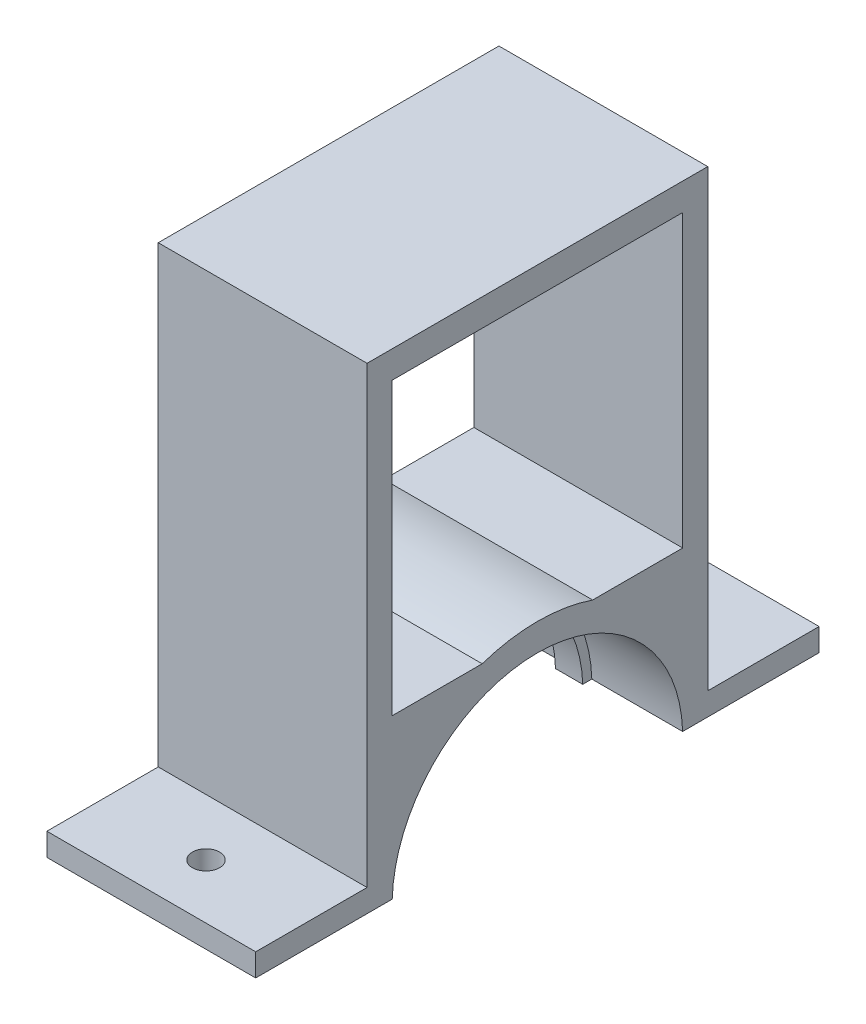
ISO-10303-21;
HEADER;
FILE_DESCRIPTION(('STEP AP214'),'2;1');
FILE_NAME('part.step','',(''),(''),'','','');
FILE_SCHEMA(('AUTOMOTIVE_DESIGN { 1 0 10303 214 1 1 1 1 }'));
ENDSEC;
DATA;
#1=APPLICATION_CONTEXT('core data for automotive mechanical design processes');
#2=APPLICATION_PROTOCOL_DEFINITION('international standard','automotive_design',2000,#1);
#3=PRODUCT_CONTEXT('',#1,'mechanical');
#4=PRODUCT('Part','Part','',(#3));
#5=PRODUCT_RELATED_PRODUCT_CATEGORY('part','',(#4));
#6=PRODUCT_DEFINITION_FORMATION('','',#4);
#7=PRODUCT_DEFINITION_CONTEXT('part definition',#1,'design');
#8=PRODUCT_DEFINITION('design','',#6,#7);
#9=PRODUCT_DEFINITION_SHAPE('','',#8);
#10=(LENGTH_UNIT() NAMED_UNIT(*) SI_UNIT(.MILLI.,.METRE.));
#11=(NAMED_UNIT(*) PLANE_ANGLE_UNIT() SI_UNIT($,.RADIAN.));
#12=(NAMED_UNIT(*) SI_UNIT($,.STERADIAN.) SOLID_ANGLE_UNIT());
#13=UNCERTAINTY_MEASURE_WITH_UNIT(LENGTH_MEASURE(1.E-05),#10,'distance_accuracy_value','');
#14=(GEOMETRIC_REPRESENTATION_CONTEXT(3) GLOBAL_UNCERTAINTY_ASSIGNED_CONTEXT((#13)) GLOBAL_UNIT_ASSIGNED_CONTEXT((#10,
#11,#12)) REPRESENTATION_CONTEXT('',''));
#15=CARTESIAN_POINT('',(0.,0.,0.));
#16=DIRECTION('',(0.,0.,1.));
#17=DIRECTION('',(1.,0.,0.));
#18=AXIS2_PLACEMENT_3D('',#15,#16,#17);
#19=CARTESIAN_POINT('',(-71.7221553746751,0.,0.));
#20=DIRECTION('',(-1.,0.,0.));
#21=DIRECTION('',(0.,0.,1.));
#22=AXIS2_PLACEMENT_3D('',#19,#20,#21);
#23=CYLINDRICAL_SURFACE('',#22,19.);
#24=CARTESIAN_POINT('',(-11.5,0.,0.));
#25=DIRECTION('',(-1.,0.,0.));
#26=DIRECTION('',(0.,0.,1.));
#27=AXIS2_PLACEMENT_3D('',#24,#25,#26);
#28=CIRCLE('',#27,19.);
#29=CARTESIAN_POINT('',(-11.5,18.,6.08276253029831));
#30=VERTEX_POINT('',#29);
#31=CARTESIAN_POINT('',(-11.5,18.,-6.08276253029831));
#32=VERTEX_POINT('',#31);
#33=EDGE_CURVE('E11',#30,#32,#28,.T.);
#34=ORIENTED_EDGE('',*,*,#33,.F.);
#35=DIRECTION('',(-1.,0.,0.));
#36=VECTOR('',#35,1.);
#37=CARTESIAN_POINT('',(11.5,18.,6.08276253029831));
#38=LINE('',#37,#36);
#39=CARTESIAN_POINT('',(11.5,18.,6.08276253029831));
#40=VERTEX_POINT('',#39);
#41=EDGE_CURVE('E250',#40,#30,#38,.T.);
#42=ORIENTED_EDGE('',*,*,#41,.F.);
#43=CARTESIAN_POINT('',(11.5,0.,0.));
#44=DIRECTION('',(-1.,0.,0.));
#45=DIRECTION('',(0.,0.,1.));
#46=AXIS2_PLACEMENT_3D('',#43,#44,#45);
#47=CIRCLE('',#46,19.);
#48=CARTESIAN_POINT('',(11.5,18.,-6.08276253029831));
#49=VERTEX_POINT('',#48);
#50=EDGE_CURVE('E52',#40,#49,#47,.T.);
#51=ORIENTED_EDGE('',*,*,#50,.T.);
#52=DIRECTION('',(-1.,0.,0.));
#53=VECTOR('',#52,1.);
#54=CARTESIAN_POINT('',(11.5,18.,-6.08276253029831));
#55=LINE('',#54,#53);
#56=EDGE_CURVE('E238',#49,#32,#55,.T.);
#57=ORIENTED_EDGE('',*,*,#56,.T.);
#58=EDGE_LOOP('',(#34,#42,#51,#57));
#59=FACE_BOUND('',#58,.T.);
#60=ADVANCED_FACE('F43',(#59),#23,.T.);
#61=CARTESIAN_POINT('',(11.5,3.00000000000001,-31.0262507904691));
#62=DIRECTION('',(0.,0.,1.));
#63=DIRECTION('',(1.,0.,0.));
#64=AXIS2_PLACEMENT_3D('',#61,#62,#63);
#65=PLANE('',#64);
#66=DIRECTION('',(0.,1.,0.));
#67=VECTOR('',#66,1.);
#68=CARTESIAN_POINT('',(11.5,3.00000000000001,-31.0262507904691));
#69=LINE('',#68,#67);
#70=CARTESIAN_POINT('',(11.5,0.5,-31.0262507904691));
#71=VERTEX_POINT('',#70);
#72=CARTESIAN_POINT('',(11.5,3.00000000000001,-31.0262507904691));
#73=VERTEX_POINT('',#72);
#74=EDGE_CURVE('E315',#71,#73,#69,.T.);
#75=ORIENTED_EDGE('',*,*,#74,.F.);
#76=DIRECTION('',(-1.,0.,0.));
#77=VECTOR('',#76,1.);
#78=CARTESIAN_POINT('',(11.5,0.5,-31.0262507904691));
#79=LINE('',#78,#77);
#80=CARTESIAN_POINT('',(-11.5,0.5,-31.0262507904691));
#81=VERTEX_POINT('',#80);
#82=EDGE_CURVE('E280',#71,#81,#79,.T.);
#83=ORIENTED_EDGE('',*,*,#82,.T.);
#84=DIRECTION('',(0.,1.,0.));
#85=VECTOR('',#84,1.);
#86=CARTESIAN_POINT('',(-11.5,3.00000000000001,-31.0262507904691));
#87=LINE('',#86,#85);
#88=CARTESIAN_POINT('',(-11.5,3.00000000000001,-31.0262507904691));
#89=VERTEX_POINT('',#88);
#90=EDGE_CURVE('E303',#81,#89,#87,.T.);
#91=ORIENTED_EDGE('',*,*,#90,.T.);
#92=DIRECTION('',(-1.,0.,0.));
#93=VECTOR('',#92,1.);
#94=CARTESIAN_POINT('',(11.5,3.00000000000001,-31.0262507904691));
#95=LINE('',#94,#93);
#96=EDGE_CURVE('E309',#73,#89,#95,.T.);
#97=ORIENTED_EDGE('',*,*,#96,.F.);
#98=EDGE_LOOP('',(#75,#83,#91,#97));
#99=FACE_BOUND('',#98,.T.);
#100=ADVANCED_FACE('F367',(#99),#65,.F.);
#101=CARTESIAN_POINT('',(-71.7221553746751,0.,0.));
#102=DIRECTION('',(-1.,0.,0.));
#103=DIRECTION('',(0.,0.,1.));
#104=AXIS2_PLACEMENT_3D('',#101,#102,#103);
#105=CYLINDRICAL_SURFACE('',#104,16.);
#106=CARTESIAN_POINT('',(-11.5,0.,0.));
#107=DIRECTION('',(-1.,0.,0.));
#108=DIRECTION('',(0.,0.,1.));
#109=AXIS2_PLACEMENT_3D('',#106,#107,#108);
#110=CIRCLE('',#109,16.);
#111=CARTESIAN_POINT('',(-11.5,0.5,15.9921855917195));
#112=VERTEX_POINT('',#111);
#113=CARTESIAN_POINT('',(-11.5,0.5,-15.9921855917195));
#114=VERTEX_POINT('',#113);
#115=EDGE_CURVE('E323',#112,#114,#110,.T.);
#116=ORIENTED_EDGE('',*,*,#115,.T.);
#117=DIRECTION('',(-1.,0.,0.));
#118=VECTOR('',#117,1.);
#119=CARTESIAN_POINT('',(-71.7221553746751,0.5,-15.9921855917195));
#120=LINE('',#119,#118);
#121=CARTESIAN_POINT('',(-1.5,0.5,-15.9921855917195));
#122=VERTEX_POINT('',#121);
#123=EDGE_CURVE('E282',#114,#122,#120,.F.);
#124=ORIENTED_EDGE('',*,*,#123,.T.);
#125=CARTESIAN_POINT('',(-1.5,0.,0.));
#126=DIRECTION('',(-1.,0.,0.));
#127=DIRECTION('',(0.,0.,1.));
#128=AXIS2_PLACEMENT_3D('',#125,#126,#127);
#129=CIRCLE('',#128,16.);
#130=CARTESIAN_POINT('',(-1.5,0.5,15.9921855917195));
#131=VERTEX_POINT('',#130);
#132=EDGE_CURVE('E326',#131,#122,#129,.T.);
#133=ORIENTED_EDGE('',*,*,#132,.F.);
#134=DIRECTION('',(-1.,0.,0.));
#135=VECTOR('',#134,1.);
#136=CARTESIAN_POINT('',(-71.7221553746751,0.5,15.9921855917195));
#137=LINE('',#136,#135);
#138=EDGE_CURVE('E263',#131,#112,#137,.T.);
#139=ORIENTED_EDGE('',*,*,#138,.T.);
#140=EDGE_LOOP('',(#116,#124,#133,#139));
#141=FACE_BOUND('',#140,.T.);
#142=ADVANCED_FACE('F374',(#141),#105,.F.);
#143=CARTESIAN_POINT('',(-1.5,0.,-16.));
#144=DIRECTION('',(1.,0.,0.));
#145=DIRECTION('',(0.,0.,-1.));
#146=AXIS2_PLACEMENT_3D('',#143,#144,#145);
#147=PLANE('',#146);
#148=ORIENTED_EDGE('',*,*,#132,.T.);
#149=DIRECTION('',(0.,0.,1.));
#150=VECTOR('',#149,1.);
#151=CARTESIAN_POINT('',(-1.5,0.5,-16.));
#152=LINE('',#151,#150);
#153=CARTESIAN_POINT('',(-1.5,0.5,-14.9916643505649));
#154=VERTEX_POINT('',#153);
#155=EDGE_CURVE('E270',#122,#154,#152,.T.);
#156=ORIENTED_EDGE('',*,*,#155,.T.);
#157=CARTESIAN_POINT('',(-1.5,0.,0.));
#158=DIRECTION('',(-1.,0.,0.));
#159=DIRECTION('',(0.,0.,1.));
#160=AXIS2_PLACEMENT_3D('',#157,#158,#159);
#161=CIRCLE('',#160,15.);
#162=CARTESIAN_POINT('',(-1.5,0.5,14.9916643505649));
#163=VERTEX_POINT('',#162);
#164=EDGE_CURVE('E329',#163,#154,#161,.T.);
#165=ORIENTED_EDGE('',*,*,#164,.F.);
#166=EDGE_CURVE('E266',#163,#131,#152,.T.);
#167=ORIENTED_EDGE('',*,*,#166,.T.);
#168=EDGE_LOOP('',(#148,#156,#165,#167));
#169=FACE_BOUND('',#168,.T.);
#170=ADVANCED_FACE('F393',(#169),#147,.F.);
#171=CARTESIAN_POINT('',(-71.7221553746751,0.,0.));
#172=DIRECTION('',(-1.,0.,0.));
#173=DIRECTION('',(0.,0.,1.));
#174=AXIS2_PLACEMENT_3D('',#171,#172,#173);
#175=CYLINDRICAL_SURFACE('',#174,15.);
#176=ORIENTED_EDGE('',*,*,#164,.T.);
#177=DIRECTION('',(-1.,0.,0.));
#178=VECTOR('',#177,1.);
#179=CARTESIAN_POINT('',(-71.7221553746751,0.5,-14.991664350565));
#180=LINE('',#179,#178);
#181=CARTESIAN_POINT('',(1.5,0.5,-14.991664350565));
#182=VERTEX_POINT('',#181);
#183=EDGE_CURVE('E285',#154,#182,#180,.F.);
#184=ORIENTED_EDGE('',*,*,#183,.T.);
#185=CARTESIAN_POINT('',(1.5,0.,0.));
#186=DIRECTION('',(-1.,0.,0.));
#187=DIRECTION('',(0.,0.,1.));
#188=AXIS2_PLACEMENT_3D('',#185,#186,#187);
#189=CIRCLE('',#188,15.);
#190=CARTESIAN_POINT('',(1.5,0.5,14.991664350565));
#191=VERTEX_POINT('',#190);
#192=EDGE_CURVE('E332',#191,#182,#189,.T.);
#193=ORIENTED_EDGE('',*,*,#192,.F.);
#194=DIRECTION('',(-1.,0.,0.));
#195=VECTOR('',#194,1.);
#196=CARTESIAN_POINT('',(-71.7221553746751,0.5,14.991664350565));
#197=LINE('',#196,#195);
#198=EDGE_CURVE('E269',#191,#163,#197,.T.);
#199=ORIENTED_EDGE('',*,*,#198,.T.);
#200=EDGE_LOOP('',(#176,#184,#193,#199));
#201=FACE_BOUND('',#200,.T.);
#202=ADVANCED_FACE('F389',(#201),#175,.F.);
#203=CARTESIAN_POINT('',(1.5,0.,-16.));
#204=DIRECTION('',(-1.,0.,0.));
#205=DIRECTION('',(0.,0.,1.));
#206=AXIS2_PLACEMENT_3D('',#203,#204,#205);
#207=PLANE('',#206);
#208=CARTESIAN_POINT('',(1.5,0.,0.));
#209=DIRECTION('',(-1.,0.,0.));
#210=DIRECTION('',(0.,0.,1.));
#211=AXIS2_PLACEMENT_3D('',#208,#209,#210);
#212=CIRCLE('',#211,16.);
#213=CARTESIAN_POINT('',(1.5,0.5,15.9921855917195));
#214=VERTEX_POINT('',#213);
#215=CARTESIAN_POINT('',(1.5,0.5,-15.9921855917195));
#216=VERTEX_POINT('',#215);
#217=EDGE_CURVE('E335',#214,#216,#212,.T.);
#218=ORIENTED_EDGE('',*,*,#217,.F.);
#219=DIRECTION('',(0.,0.,-1.));
#220=VECTOR('',#219,1.);
#221=CARTESIAN_POINT('',(1.5,0.5,-16.));
#222=LINE('',#221,#220);
#223=EDGE_CURVE('E273',#214,#191,#222,.T.);
#224=ORIENTED_EDGE('',*,*,#223,.T.);
#225=ORIENTED_EDGE('',*,*,#192,.T.);
#226=EDGE_CURVE('E277',#182,#216,#222,.T.);
#227=ORIENTED_EDGE('',*,*,#226,.T.);
#228=EDGE_LOOP('',(#218,#224,#225,#227));
#229=FACE_BOUND('',#228,.T.);
#230=ADVANCED_FACE('F385',(#229),#207,.F.);
#231=CARTESIAN_POINT('',(-71.7221553746751,0.,0.));
#232=DIRECTION('',(-1.,0.,0.));
#233=DIRECTION('',(0.,0.,1.));
#234=AXIS2_PLACEMENT_3D('',#231,#232,#233);
#235=CYLINDRICAL_SURFACE('',#234,16.);
#236=ORIENTED_EDGE('',*,*,#217,.T.);
#237=DIRECTION('',(-1.,0.,0.));
#238=VECTOR('',#237,1.);
#239=CARTESIAN_POINT('',(-71.7221553746751,0.5,-15.9921855917195));
#240=LINE('',#239,#238);
#241=CARTESIAN_POINT('',(11.5,0.5,-15.9921855917195));
#242=VERTEX_POINT('',#241);
#243=EDGE_CURVE('E288',#216,#242,#240,.F.);
#244=ORIENTED_EDGE('',*,*,#243,.T.);
#245=CARTESIAN_POINT('',(11.5,0.,0.));
#246=DIRECTION('',(-1.,0.,0.));
#247=DIRECTION('',(0.,0.,1.));
#248=AXIS2_PLACEMENT_3D('',#245,#246,#247);
#249=CIRCLE('',#248,16.);
#250=CARTESIAN_POINT('',(11.5,0.5,15.9921855917195));
#251=VERTEX_POINT('',#250);
#252=EDGE_CURVE('E338',#251,#242,#249,.T.);
#253=ORIENTED_EDGE('',*,*,#252,.F.);
#254=DIRECTION('',(-1.,0.,0.));
#255=VECTOR('',#254,1.);
#256=CARTESIAN_POINT('',(-71.7221553746751,0.5,15.9921855917195));
#257=LINE('',#256,#255);
#258=EDGE_CURVE('E276',#251,#214,#257,.T.);
#259=ORIENTED_EDGE('',*,*,#258,.T.);
#260=EDGE_LOOP('',(#236,#244,#253,#259));
#261=FACE_BOUND('',#260,.T.);
#262=ADVANCED_FACE('F382',(#261),#235,.F.);
#263=CARTESIAN_POINT('',(11.5,3.,31.0262507904691));
#264=DIRECTION('',(0.,0.,-1.));
#265=DIRECTION('',(-1.,0.,0.));
#266=AXIS2_PLACEMENT_3D('',#263,#264,#265);
#267=PLANE('',#266);
#268=DIRECTION('',(0.,-1.,0.));
#269=VECTOR('',#268,1.);
#270=CARTESIAN_POINT('',(-11.5,3.,31.0262507904691));
#271=LINE('',#270,#269);
#272=CARTESIAN_POINT('',(-11.5,3.,31.0262507904691));
#273=VERTEX_POINT('',#272);
#274=CARTESIAN_POINT('',(-11.5,0.5,31.0262507904691));
#275=VERTEX_POINT('',#274);
#276=EDGE_CURVE('E298',#273,#275,#271,.T.);
#277=ORIENTED_EDGE('',*,*,#276,.T.);
#278=DIRECTION('',(1.,0.,0.));
#279=VECTOR('',#278,1.);
#280=CARTESIAN_POINT('',(11.5,0.5,31.0262507904691));
#281=LINE('',#280,#279);
#282=CARTESIAN_POINT('',(11.5,0.5,31.0262507904691));
#283=VERTEX_POINT('',#282);
#284=EDGE_CURVE('E256',#275,#283,#281,.T.);
#285=ORIENTED_EDGE('',*,*,#284,.T.);
#286=DIRECTION('',(0.,-1.,0.));
#287=VECTOR('',#286,1.);
#288=CARTESIAN_POINT('',(11.5,3.,31.0262507904691));
#289=LINE('',#288,#287);
#290=CARTESIAN_POINT('',(11.5,3.,31.0262507904691));
#291=VERTEX_POINT('',#290);
#292=EDGE_CURVE('E297',#291,#283,#289,.T.);
#293=ORIENTED_EDGE('',*,*,#292,.F.);
#294=DIRECTION('',(-1.,0.,0.));
#295=VECTOR('',#294,1.);
#296=CARTESIAN_POINT('',(11.5,3.,31.0262507904691));
#297=LINE('',#296,#295);
#298=EDGE_CURVE('E300',#291,#273,#297,.T.);
#299=ORIENTED_EDGE('',*,*,#298,.T.);
#300=EDGE_LOOP('',(#277,#285,#293,#299));
#301=FACE_BOUND('',#300,.T.);
#302=ADVANCED_FACE('F380',(#301),#267,.F.);
#303=CARTESIAN_POINT('',(11.5,0.,-16.));
#304=DIRECTION('',(-1.,0.,0.));
#305=DIRECTION('',(0.,0.,1.));
#306=AXIS2_PLACEMENT_3D('',#303,#304,#305);
#307=PLANE('',#306);
#308=DIRECTION('',(0.,0.,-1.));
#309=VECTOR('',#308,1.);
#310=CARTESIAN_POINT('',(11.5,18.,0.));
#311=LINE('',#310,#309);
#312=CARTESIAN_POINT('',(11.5,18.,-16.));
#313=VERTEX_POINT('',#312);
#314=EDGE_CURVE('E214',#49,#313,#311,.T.);
#315=ORIENTED_EDGE('',*,*,#314,.F.);
#316=ORIENTED_EDGE('',*,*,#50,.F.);
#317=CARTESIAN_POINT('',(11.5,18.,16.));
#318=VERTEX_POINT('',#317);
#319=EDGE_CURVE('E209',#318,#40,#311,.T.);
#320=ORIENTED_EDGE('',*,*,#319,.F.);
#321=DIRECTION('',(0.,-1.,0.));
#322=VECTOR('',#321,1.);
#323=CARTESIAN_POINT('',(11.5,0.,16.));
#324=LINE('',#323,#322);
#325=CARTESIAN_POINT('',(11.5,50.,16.));
#326=VERTEX_POINT('',#325);
#327=EDGE_CURVE('E213',#326,#318,#324,.T.);
#328=ORIENTED_EDGE('',*,*,#327,.F.);
#329=DIRECTION('',(0.,0.,-1.));
#330=VECTOR('',#329,1.);
#331=CARTESIAN_POINT('',(11.5,50.,0.));
#332=LINE('',#331,#330);
#333=CARTESIAN_POINT('',(11.5,50.,-16.));
#334=VERTEX_POINT('',#333);
#335=EDGE_CURVE('E217',#326,#334,#332,.T.);
#336=ORIENTED_EDGE('',*,*,#335,.T.);
#337=DIRECTION('',(0.,-1.,0.));
#338=VECTOR('',#337,1.);
#339=CARTESIAN_POINT('',(11.5,0.,-16.));
#340=LINE('',#339,#338);
#341=EDGE_CURVE('E219',#334,#313,#340,.T.);
#342=ORIENTED_EDGE('',*,*,#341,.T.);
#343=EDGE_LOOP('',(#315,#316,#320,#328,#336,#342));
#344=FACE_BOUND('',#343,.T.);
#345=ORIENTED_EDGE('',*,*,#292,.T.);
#346=DIRECTION('',(0.,0.,-1.));
#347=VECTOR('',#346,1.);
#348=CARTESIAN_POINT('',(11.5,0.5,-16.));
#349=LINE('',#348,#347);
#350=EDGE_CURVE('E68',#283,#251,#349,.T.);
#351=ORIENTED_EDGE('',*,*,#350,.T.);
#352=ORIENTED_EDGE('',*,*,#252,.T.);
#353=EDGE_CURVE('E260',#242,#71,#349,.T.);
#354=ORIENTED_EDGE('',*,*,#353,.T.);
#355=ORIENTED_EDGE('',*,*,#74,.T.);
#356=DIRECTION('',(0.,0.,1.));
#357=VECTOR('',#356,1.);
#358=CARTESIAN_POINT('',(11.5,3.00000000000001,-17.4601205824056));
#359=LINE('',#358,#357);
#360=CARTESIAN_POINT('',(11.5,3.00000000000001,-18.7616630392937));
#361=VERTEX_POINT('',#360);
#362=EDGE_CURVE('E191',#73,#361,#359,.T.);
#363=ORIENTED_EDGE('',*,*,#362,.T.);
#364=DIRECTION('',(0.,1.,0.));
#365=VECTOR('',#364,1.);
#366=CARTESIAN_POINT('',(11.5,0.,-18.7616630392937));
#367=LINE('',#366,#365);
#368=CARTESIAN_POINT('',(11.5,53.,-18.7616630392937));
#369=VERTEX_POINT('',#368);
#370=EDGE_CURVE('E182',#361,#369,#367,.T.);
#371=ORIENTED_EDGE('',*,*,#370,.T.);
#372=DIRECTION('',(0.,0.,-1.));
#373=VECTOR('',#372,1.);
#374=CARTESIAN_POINT('',(11.5,53.,0.));
#375=LINE('',#374,#373);
#376=CARTESIAN_POINT('',(11.5,53.,18.7616630392938));
#377=VERTEX_POINT('',#376);
#378=EDGE_CURVE('E188',#377,#369,#375,.T.);
#379=ORIENTED_EDGE('',*,*,#378,.F.);
#380=DIRECTION('',(0.,1.,0.));
#381=VECTOR('',#380,1.);
#382=CARTESIAN_POINT('',(11.5,0.,18.7616630392938));
#383=LINE('',#382,#381);
#384=CARTESIAN_POINT('',(11.5,3.,18.7616630392938));
#385=VERTEX_POINT('',#384);
#386=EDGE_CURVE('E207',#385,#377,#383,.T.);
#387=ORIENTED_EDGE('',*,*,#386,.F.);
#388=DIRECTION('',(0.,0.,1.));
#389=VECTOR('',#388,1.);
#390=CARTESIAN_POINT('',(11.5,3.,17.4601205824056));
#391=LINE('',#390,#389);
#392=EDGE_CURVE('E295',#385,#291,#391,.T.);
#393=ORIENTED_EDGE('',*,*,#392,.T.);
#394=EDGE_LOOP('',(#345,#351,#352,#354,#355,#363,#371,#379,#387,#393));
#395=FACE_BOUND('',#394,.T.);
#396=ADVANCED_FACE('F185',(#344,#395),#307,.F.);
#397=CARTESIAN_POINT('',(-11.5,0.,-16.));
#398=DIRECTION('',(1.,0.,0.));
#399=DIRECTION('',(0.,0.,-1.));
#400=AXIS2_PLACEMENT_3D('',#397,#398,#399);
#401=PLANE('',#400);
#402=ORIENTED_EDGE('',*,*,#33,.T.);
#403=DIRECTION('',(0.,0.,-1.));
#404=VECTOR('',#403,1.);
#405=CARTESIAN_POINT('',(-11.5,18.,0.));
#406=LINE('',#405,#404);
#407=CARTESIAN_POINT('',(-11.5,18.,-16.));
#408=VERTEX_POINT('',#407);
#409=EDGE_CURVE('E194',#32,#408,#406,.T.);
#410=ORIENTED_EDGE('',*,*,#409,.T.);
#411=DIRECTION('',(0.,-1.,0.));
#412=VECTOR('',#411,1.);
#413=CARTESIAN_POINT('',(-11.5,0.,-16.));
#414=LINE('',#413,#412);
#415=CARTESIAN_POINT('',(-11.5,50.,-16.));
#416=VERTEX_POINT('',#415);
#417=EDGE_CURVE('E235',#416,#408,#414,.T.);
#418=ORIENTED_EDGE('',*,*,#417,.F.);
#419=DIRECTION('',(0.,0.,-1.));
#420=VECTOR('',#419,1.);
#421=CARTESIAN_POINT('',(-11.5,50.,0.));
#422=LINE('',#421,#420);
#423=CARTESIAN_POINT('',(-11.5,50.,16.));
#424=VERTEX_POINT('',#423);
#425=EDGE_CURVE('E233',#424,#416,#422,.T.);
#426=ORIENTED_EDGE('',*,*,#425,.F.);
#427=DIRECTION('',(0.,-1.,0.));
#428=VECTOR('',#427,1.);
#429=CARTESIAN_POINT('',(-11.5,0.,16.));
#430=LINE('',#429,#428);
#431=CARTESIAN_POINT('',(-11.5,18.,16.));
#432=VERTEX_POINT('',#431);
#433=EDGE_CURVE('E230',#424,#432,#430,.T.);
#434=ORIENTED_EDGE('',*,*,#433,.T.);
#435=EDGE_CURVE('E227',#432,#30,#406,.T.);
#436=ORIENTED_EDGE('',*,*,#435,.T.);
#437=EDGE_LOOP('',(#402,#410,#418,#426,#434,#436));
#438=FACE_BOUND('',#437,.T.);
#439=ORIENTED_EDGE('',*,*,#90,.F.);
#440=DIRECTION('',(0.,0.,1.));
#441=VECTOR('',#440,1.);
#442=CARTESIAN_POINT('',(-11.5,0.5,-16.));
#443=LINE('',#442,#441);
#444=EDGE_CURVE('E60',#81,#114,#443,.T.);
#445=ORIENTED_EDGE('',*,*,#444,.T.);
#446=ORIENTED_EDGE('',*,*,#115,.F.);
#447=EDGE_CURVE('E259',#112,#275,#443,.T.);
#448=ORIENTED_EDGE('',*,*,#447,.T.);
#449=ORIENTED_EDGE('',*,*,#276,.F.);
#450=DIRECTION('',(0.,0.,1.));
#451=VECTOR('',#450,1.);
#452=CARTESIAN_POINT('',(-11.5,3.,17.4601205824056));
#453=LINE('',#452,#451);
#454=CARTESIAN_POINT('',(-11.5,3.,18.7616630392937));
#455=VERTEX_POINT('',#454);
#456=EDGE_CURVE('E301',#455,#273,#453,.T.);
#457=ORIENTED_EDGE('',*,*,#456,.F.);
#458=DIRECTION('',(0.,1.,0.));
#459=VECTOR('',#458,1.);
#460=CARTESIAN_POINT('',(-11.5,0.,18.7616630392938));
#461=LINE('',#460,#459);
#462=CARTESIAN_POINT('',(-11.5,53.,18.7616630392938));
#463=VERTEX_POINT('',#462);
#464=EDGE_CURVE('E224',#455,#463,#461,.T.);
#465=ORIENTED_EDGE('',*,*,#464,.T.);
#466=DIRECTION('',(0.,0.,-1.));
#467=VECTOR('',#466,1.);
#468=CARTESIAN_POINT('',(-11.5,53.,0.));
#469=LINE('',#468,#467);
#470=CARTESIAN_POINT('',(-11.5,53.,-18.7616630392937));
#471=VERTEX_POINT('',#470);
#472=EDGE_CURVE('E222',#463,#471,#469,.T.);
#473=ORIENTED_EDGE('',*,*,#472,.T.);
#474=DIRECTION('',(0.,1.,0.));
#475=VECTOR('',#474,1.);
#476=CARTESIAN_POINT('',(-11.5,0.,-18.7616630392937));
#477=LINE('',#476,#475);
#478=CARTESIAN_POINT('',(-11.5,3.00000000000001,-18.7616630392937));
#479=VERTEX_POINT('',#478);
#480=EDGE_CURVE('E200',#479,#471,#477,.T.);
#481=ORIENTED_EDGE('',*,*,#480,.F.);
#482=DIRECTION('',(0.,0.,1.));
#483=VECTOR('',#482,1.);
#484=CARTESIAN_POINT('',(-11.5,3.00000000000001,-17.4601205824056));
#485=LINE('',#484,#483);
#486=EDGE_CURVE('E312',#89,#479,#485,.T.);
#487=ORIENTED_EDGE('',*,*,#486,.F.);
#488=EDGE_LOOP('',(#439,#445,#446,#448,#449,#457,#465,#473,#481,#487));
#489=FACE_BOUND('',#488,.T.);
#490=ADVANCED_FACE('F45',(#438,#489),#401,.F.);
#491=CARTESIAN_POINT('',(11.5,3.00000000000001,-17.4601205824056));
#492=DIRECTION('',(0.,-1.,0.));
#493=DIRECTION('',(0.,0.,-1.));
#494=AXIS2_PLACEMENT_3D('',#491,#492,#493);
#495=PLANE('',#494);
#496=CARTESIAN_POINT('',(0.,3.00000000000001,-25.));
#497=DIRECTION('',(0.,-1.,0.));
#498=DIRECTION('',(0.,0.,-1.));
#499=AXIS2_PLACEMENT_3D('',#496,#497,#498);
#500=CIRCLE('',#499,1.5);
#501=CARTESIAN_POINT('',(0.,3.00000000000001,-26.5));
#502=VERTEX_POINT('',#501);
#503=EDGE_CURVE('E294',#502,#502,#500,.T.);
#504=ORIENTED_EDGE('',*,*,#503,.T.);
#505=EDGE_LOOP('',(#504));
#506=FACE_BOUND('',#505,.T.);
#507=ORIENTED_EDGE('',*,*,#486,.T.);
#508=DIRECTION('',(-1.,0.,0.));
#509=VECTOR('',#508,1.);
#510=CARTESIAN_POINT('',(-71.7221553746751,3.00000000000001,-18.7616630392937));
#511=LINE('',#510,#509);
#512=EDGE_CURVE('E308',#479,#361,#511,.F.);
#513=ORIENTED_EDGE('',*,*,#512,.T.);
#514=ORIENTED_EDGE('',*,*,#362,.F.);
#515=ORIENTED_EDGE('',*,*,#96,.T.);
#516=EDGE_LOOP('',(#507,#513,#514,#515));
#517=FACE_BOUND('',#516,.T.);
#518=ADVANCED_FACE('F345',(#506,#517),#495,.F.);
#519=CARTESIAN_POINT('',(0.,-11.5,-25.));
#520=DIRECTION('',(0.,1.,0.));
#521=DIRECTION('',(0.,0.,1.));
#522=AXIS2_PLACEMENT_3D('',#519,#520,#521);
#523=CYLINDRICAL_SURFACE('',#522,1.5);
#524=CARTESIAN_POINT('',(0.,0.5,-25.));
#525=DIRECTION('',(0.,1.,0.));
#526=DIRECTION('',(0.,0.,1.));
#527=AXIS2_PLACEMENT_3D('',#524,#525,#526);
#528=CIRCLE('',#527,1.5);
#529=CARTESIAN_POINT('',(0.,0.5,-23.5));
#530=VERTEX_POINT('',#529);
#531=EDGE_CURVE('E47',#530,#530,#528,.F.);
#532=ORIENTED_EDGE('',*,*,#531,.T.);
#533=EDGE_LOOP('',(#532));
#534=FACE_BOUND('',#533,.T.);
#535=ORIENTED_EDGE('',*,*,#503,.F.);
#536=EDGE_LOOP('',(#535));
#537=FACE_BOUND('',#536,.T.);
#538=ADVANCED_FACE('F348',(#534,#537),#523,.F.);
#539=CARTESIAN_POINT('',(11.5,3.,17.4601205824056));
#540=DIRECTION('',(0.,-1.,0.));
#541=DIRECTION('',(0.,0.,-1.));
#542=AXIS2_PLACEMENT_3D('',#539,#540,#541);
#543=PLANE('',#542);
#544=CARTESIAN_POINT('',(0.,3.,25.));
#545=DIRECTION('',(0.,-1.,0.));
#546=DIRECTION('',(0.,0.,-1.));
#547=AXIS2_PLACEMENT_3D('',#544,#545,#546);
#548=CIRCLE('',#547,1.5);
#549=CARTESIAN_POINT('',(0.,3.,23.5));
#550=VERTEX_POINT('',#549);
#551=EDGE_CURVE('E291',#550,#550,#548,.T.);
#552=ORIENTED_EDGE('',*,*,#551,.T.);
#553=EDGE_LOOP('',(#552));
#554=FACE_BOUND('',#553,.T.);
#555=ORIENTED_EDGE('',*,*,#392,.F.);
#556=DIRECTION('',(-1.,0.,0.));
#557=VECTOR('',#556,1.);
#558=CARTESIAN_POINT('',(-71.7221553746751,3.,18.7616630392937));
#559=LINE('',#558,#557);
#560=EDGE_CURVE('E320',#385,#455,#559,.T.);
#561=ORIENTED_EDGE('',*,*,#560,.T.);
#562=ORIENTED_EDGE('',*,*,#456,.T.);
#563=ORIENTED_EDGE('',*,*,#298,.F.);
#564=EDGE_LOOP('',(#555,#561,#562,#563));
#565=FACE_BOUND('',#564,.T.);
#566=ADVANCED_FACE('F350',(#554,#565),#543,.F.);
#567=CARTESIAN_POINT('',(0.,-11.5,25.));
#568=DIRECTION('',(0.,1.,0.));
#569=DIRECTION('',(0.,0.,1.));
#570=AXIS2_PLACEMENT_3D('',#567,#568,#569);
#571=CYLINDRICAL_SURFACE('',#570,1.5);
#572=CARTESIAN_POINT('',(0.,0.5,25.));
#573=DIRECTION('',(0.,1.,0.));
#574=DIRECTION('',(0.,0.,1.));
#575=AXIS2_PLACEMENT_3D('',#572,#573,#574);
#576=CIRCLE('',#575,1.5);
#577=CARTESIAN_POINT('',(0.,0.5,26.5));
#578=VERTEX_POINT('',#577);
#579=EDGE_CURVE('E253',#578,#578,#576,.F.);
#580=ORIENTED_EDGE('',*,*,#579,.T.);
#581=EDGE_LOOP('',(#580));
#582=FACE_BOUND('',#581,.T.);
#583=ORIENTED_EDGE('',*,*,#551,.F.);
#584=EDGE_LOOP('',(#583));
#585=FACE_BOUND('',#584,.T.);
#586=ADVANCED_FACE('F358',(#582,#585),#571,.F.);
#587=CARTESIAN_POINT('',(-26.,0.5,37.8752027899532));
#588=DIRECTION('',(0.,1.,0.));
#589=DIRECTION('',(0.,0.,1.));
#590=AXIS2_PLACEMENT_3D('',#587,#588,#589);
#591=PLANE('',#590);
#592=ORIENTED_EDGE('',*,*,#531,.F.);
#593=EDGE_LOOP('',(#592));
#594=FACE_BOUND('',#593,.T.);
#595=ORIENTED_EDGE('',*,*,#226,.F.);
#596=ORIENTED_EDGE('',*,*,#183,.F.);
#597=ORIENTED_EDGE('',*,*,#155,.F.);
#598=ORIENTED_EDGE('',*,*,#123,.F.);
#599=ORIENTED_EDGE('',*,*,#444,.F.);
#600=ORIENTED_EDGE('',*,*,#82,.F.);
#601=ORIENTED_EDGE('',*,*,#353,.F.);
#602=ORIENTED_EDGE('',*,*,#243,.F.);
#603=EDGE_LOOP('',(#595,#596,#597,#598,#599,#600,#601,#602));
#604=FACE_BOUND('',#603,.T.);
#605=ADVANCED_FACE('F402',(#594,#604),#591,.F.);
#606=ORIENTED_EDGE('',*,*,#579,.F.);
#607=EDGE_LOOP('',(#606));
#608=FACE_BOUND('',#607,.T.);
#609=ORIENTED_EDGE('',*,*,#350,.F.);
#610=ORIENTED_EDGE('',*,*,#284,.F.);
#611=ORIENTED_EDGE('',*,*,#447,.F.);
#612=ORIENTED_EDGE('',*,*,#138,.F.);
#613=ORIENTED_EDGE('',*,*,#166,.F.);
#614=ORIENTED_EDGE('',*,*,#198,.F.);
#615=ORIENTED_EDGE('',*,*,#223,.F.);
#616=ORIENTED_EDGE('',*,*,#258,.F.);
#617=EDGE_LOOP('',(#609,#610,#611,#612,#613,#614,#615,#616));
#618=FACE_BOUND('',#617,.T.);
#619=ADVANCED_FACE('F407',(#608,#618),#591,.F.);
#620=CARTESIAN_POINT('',(11.5,0.,-18.7616630392937));
#621=DIRECTION('',(0.,0.,1.));
#622=DIRECTION('',(1.,0.,0.));
#623=AXIS2_PLACEMENT_3D('',#620,#621,#622);
#624=PLANE('',#623);
#625=ORIENTED_EDGE('',*,*,#480,.T.);
#626=DIRECTION('',(-1.,0.,0.));
#627=VECTOR('',#626,1.);
#628=CARTESIAN_POINT('',(11.5,53.,-18.7616630392937));
#629=LINE('',#628,#627);
#630=EDGE_CURVE('E197',#369,#471,#629,.T.);
#631=ORIENTED_EDGE('',*,*,#630,.F.);
#632=ORIENTED_EDGE('',*,*,#370,.F.);
#633=ORIENTED_EDGE('',*,*,#512,.F.);
#634=EDGE_LOOP('',(#625,#631,#632,#633));
#635=FACE_BOUND('',#634,.T.);
#636=ADVANCED_FACE('F198',(#635),#624,.F.);
#637=CARTESIAN_POINT('',(11.5,53.,0.));
#638=DIRECTION('',(0.,1.,0.));
#639=DIRECTION('',(0.,0.,1.));
#640=AXIS2_PLACEMENT_3D('',#637,#638,#639);
#641=PLANE('',#640);
#642=ORIENTED_EDGE('',*,*,#472,.F.);
#643=DIRECTION('',(-1.,0.,0.));
#644=VECTOR('',#643,1.);
#645=CARTESIAN_POINT('',(11.5,53.,18.7616630392938));
#646=LINE('',#645,#644);
#647=EDGE_CURVE('E204',#377,#463,#646,.T.);
#648=ORIENTED_EDGE('',*,*,#647,.F.);
#649=ORIENTED_EDGE('',*,*,#378,.T.);
#650=ORIENTED_EDGE('',*,*,#630,.T.);
#651=EDGE_LOOP('',(#642,#648,#649,#650));
#652=FACE_BOUND('',#651,.T.);
#653=ADVANCED_FACE('F206',(#652),#641,.T.);
#654=CARTESIAN_POINT('',(11.5,0.,18.7616630392938));
#655=DIRECTION('',(0.,0.,1.));
#656=DIRECTION('',(1.,0.,0.));
#657=AXIS2_PLACEMENT_3D('',#654,#655,#656);
#658=PLANE('',#657);
#659=ORIENTED_EDGE('',*,*,#464,.F.);
#660=ORIENTED_EDGE('',*,*,#560,.F.);
#661=ORIENTED_EDGE('',*,*,#386,.T.);
#662=ORIENTED_EDGE('',*,*,#647,.T.);
#663=EDGE_LOOP('',(#659,#660,#661,#662));
#664=FACE_BOUND('',#663,.T.);
#665=ADVANCED_FACE('F417',(#664),#658,.T.);
#666=CARTESIAN_POINT('',(11.5,18.,0.));
#667=DIRECTION('',(0.,1.,0.));
#668=DIRECTION('',(0.,0.,1.));
#669=AXIS2_PLACEMENT_3D('',#666,#667,#668);
#670=PLANE('',#669);
#671=ORIENTED_EDGE('',*,*,#435,.F.);
#672=DIRECTION('',(-1.,0.,0.));
#673=VECTOR('',#672,1.);
#674=CARTESIAN_POINT('',(11.5,18.,16.));
#675=LINE('',#674,#673);
#676=EDGE_CURVE('E248',#318,#432,#675,.T.);
#677=ORIENTED_EDGE('',*,*,#676,.F.);
#678=ORIENTED_EDGE('',*,*,#319,.T.);
#679=ORIENTED_EDGE('',*,*,#41,.T.);
#680=EDGE_LOOP('',(#671,#677,#678,#679));
#681=FACE_BOUND('',#680,.T.);
#682=ADVANCED_FACE('F444',(#681),#670,.T.);
#683=CARTESIAN_POINT('',(11.5,0.,16.));
#684=DIRECTION('',(0.,0.,-1.));
#685=DIRECTION('',(0.,1.,0.));
#686=AXIS2_PLACEMENT_3D('',#683,#684,#685);
#687=PLANE('',#686);
#688=ORIENTED_EDGE('',*,*,#433,.F.);
#689=DIRECTION('',(-1.,0.,0.));
#690=VECTOR('',#689,1.);
#691=CARTESIAN_POINT('',(11.5,50.,16.));
#692=LINE('',#691,#690);
#693=EDGE_CURVE('E246',#326,#424,#692,.T.);
#694=ORIENTED_EDGE('',*,*,#693,.F.);
#695=ORIENTED_EDGE('',*,*,#327,.T.);
#696=ORIENTED_EDGE('',*,*,#676,.T.);
#697=EDGE_LOOP('',(#688,#694,#695,#696));
#698=FACE_BOUND('',#697,.T.);
#699=ADVANCED_FACE('F445',(#698),#687,.T.);
#700=CARTESIAN_POINT('',(11.5,50.,0.));
#701=DIRECTION('',(0.,1.,0.));
#702=DIRECTION('',(0.,0.,1.));
#703=AXIS2_PLACEMENT_3D('',#700,#701,#702);
#704=PLANE('',#703);
#705=ORIENTED_EDGE('',*,*,#425,.T.);
#706=DIRECTION('',(-1.,0.,0.));
#707=VECTOR('',#706,1.);
#708=CARTESIAN_POINT('',(11.5,50.,-16.));
#709=LINE('',#708,#707);
#710=EDGE_CURVE('E243',#334,#416,#709,.T.);
#711=ORIENTED_EDGE('',*,*,#710,.F.);
#712=ORIENTED_EDGE('',*,*,#335,.F.);
#713=ORIENTED_EDGE('',*,*,#693,.T.);
#714=EDGE_LOOP('',(#705,#711,#712,#713));
#715=FACE_BOUND('',#714,.T.);
#716=ADVANCED_FACE('F448',(#715),#704,.F.);
#717=CARTESIAN_POINT('',(11.5,0.,-16.));
#718=DIRECTION('',(0.,0.,-1.));
#719=DIRECTION('',(0.,1.,0.));
#720=AXIS2_PLACEMENT_3D('',#717,#718,#719);
#721=PLANE('',#720);
#722=ORIENTED_EDGE('',*,*,#417,.T.);
#723=DIRECTION('',(-1.,0.,0.));
#724=VECTOR('',#723,1.);
#725=CARTESIAN_POINT('',(11.5,18.,-16.));
#726=LINE('',#725,#724);
#727=EDGE_CURVE('E241',#313,#408,#726,.T.);
#728=ORIENTED_EDGE('',*,*,#727,.F.);
#729=ORIENTED_EDGE('',*,*,#341,.F.);
#730=ORIENTED_EDGE('',*,*,#710,.T.);
#731=EDGE_LOOP('',(#722,#728,#729,#730));
#732=FACE_BOUND('',#731,.T.);
#733=ADVANCED_FACE('F452',(#732),#721,.F.);
#734=ORIENTED_EDGE('',*,*,#409,.F.);
#735=ORIENTED_EDGE('',*,*,#56,.F.);
#736=ORIENTED_EDGE('',*,*,#314,.T.);
#737=ORIENTED_EDGE('',*,*,#727,.T.);
#738=EDGE_LOOP('',(#734,#735,#736,#737));
#739=FACE_BOUND('',#738,.T.);
#740=ADVANCED_FACE('F456',(#739),#670,.T.);
#741=CLOSED_SHELL('',(#60,#100,#142,#170,#202,#230,#262,#302,#396,#490,#518,#538,#566,#586,#605,
#619,#636,#653,#665,#682,#699,#716,#733,#740));
#742=MANIFOLD_SOLID_BREP('B2',#741);
#743=ADVANCED_BREP_SHAPE_REPRESENTATION('',(#18,#742),#14);
#744=SHAPE_DEFINITION_REPRESENTATION(#9,#743);
ENDSEC;
END-ISO-10303-21;
